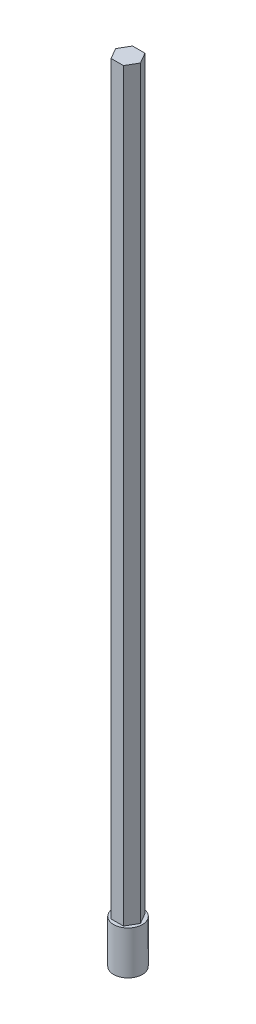
ISO-10303-21;
HEADER;
FILE_DESCRIPTION(('STEP AP214'),'2;1');
FILE_NAME('part.step','',(''),(''),'','','');
FILE_SCHEMA(('AUTOMOTIVE_DESIGN { 1 0 10303 214 1 1 1 1 }'));
ENDSEC;
DATA;
#1=APPLICATION_CONTEXT('core data for automotive mechanical design processes');
#2=APPLICATION_PROTOCOL_DEFINITION('international standard','automotive_design',2000,#1);
#3=PRODUCT_CONTEXT('',#1,'mechanical');
#4=PRODUCT('Part','Part','',(#3));
#5=PRODUCT_RELATED_PRODUCT_CATEGORY('part','',(#4));
#6=PRODUCT_DEFINITION_FORMATION('','',#4);
#7=PRODUCT_DEFINITION_CONTEXT('part definition',#1,'design');
#8=PRODUCT_DEFINITION('design','',#6,#7);
#9=PRODUCT_DEFINITION_SHAPE('','',#8);
#10=(LENGTH_UNIT() NAMED_UNIT(*) SI_UNIT(.MILLI.,.METRE.));
#11=(NAMED_UNIT(*) PLANE_ANGLE_UNIT() SI_UNIT($,.RADIAN.));
#12=(NAMED_UNIT(*) SI_UNIT($,.STERADIAN.) SOLID_ANGLE_UNIT());
#13=UNCERTAINTY_MEASURE_WITH_UNIT(LENGTH_MEASURE(1.E-05),#10,'distance_accuracy_value','');
#14=(GEOMETRIC_REPRESENTATION_CONTEXT(3) GLOBAL_UNCERTAINTY_ASSIGNED_CONTEXT((#13)) GLOBAL_UNIT_ASSIGNED_CONTEXT((#10,
#11,#12)) REPRESENTATION_CONTEXT('',''));
#15=CARTESIAN_POINT('',(0.,0.,0.));
#16=DIRECTION('',(0.,0.,1.));
#17=DIRECTION('',(1.,0.,0.));
#18=AXIS2_PLACEMENT_3D('',#15,#16,#17);
#19=CARTESIAN_POINT('',(86.6025403784457,11000.,149.999999999999));
#20=DIRECTION('',(-0.866025403784442,0.,-0.499999999999995));
#21=DIRECTION('',(-0.499999999999995,0.,0.866025403784442));
#22=AXIS2_PLACEMENT_3D('',#19,#20,#21);
#23=PLANE('',#22);
#24=DIRECTION('',(-0.499999999999995,0.,0.866025403784442));
#25=VECTOR('',#24,1.);
#26=CARTESIAN_POINT('',(86.6025403784457,604.000000000001,149.999999999999));
#27=LINE('',#26,#25);
#28=CARTESIAN_POINT('',(173.205080756888,604.000000000001,0.));
#29=VERTEX_POINT('',#28);
#30=CARTESIAN_POINT('',(86.6025403784457,604.000000000001,149.999999999999));
#31=VERTEX_POINT('',#30);
#32=EDGE_CURVE('E47',#29,#31,#27,.T.);
#33=ORIENTED_EDGE('',*,*,#32,.F.);
#34=DIRECTION('',(0.,-1.,0.));
#35=VECTOR('',#34,1.);
#36=CARTESIAN_POINT('',(173.205080756888,11000.,0.));
#37=LINE('',#36,#35);
#38=CARTESIAN_POINT('',(173.205080756888,11000.,0.));
#39=VERTEX_POINT('',#38);
#40=EDGE_CURVE('E40',#39,#29,#37,.T.);
#41=ORIENTED_EDGE('',*,*,#40,.F.);
#42=DIRECTION('',(0.499999999999995,0.,-0.866025403784442));
#43=VECTOR('',#42,1.);
#44=CARTESIAN_POINT('',(86.6025403784457,11000.,149.999999999999));
#45=LINE('',#44,#43);
#46=CARTESIAN_POINT('',(86.6025403784457,11000.,149.999999999999));
#47=VERTEX_POINT('',#46);
#48=EDGE_CURVE('E110',#47,#39,#45,.T.);
#49=ORIENTED_EDGE('',*,*,#48,.F.);
#50=DIRECTION('',(0.,-1.,0.));
#51=VECTOR('',#50,1.);
#52=CARTESIAN_POINT('',(86.6025403784457,11000.,149.999999999999));
#53=LINE('',#52,#51);
#54=EDGE_CURVE('E96',#47,#31,#53,.T.);
#55=ORIENTED_EDGE('',*,*,#54,.T.);
#56=EDGE_LOOP('',(#33,#41,#49,#55));
#57=FACE_BOUND('',#56,.T.);
#58=ADVANCED_FACE('F33',(#57),#23,.F.);
#59=CARTESIAN_POINT('',(173.205080756888,11000.,0.));
#60=DIRECTION('',(-0.866025403784438,0.,0.500000000000001));
#61=DIRECTION('',(0.500000000000001,0.,0.866025403784438));
#62=AXIS2_PLACEMENT_3D('',#59,#60,#61);
#63=PLANE('',#62);
#64=DIRECTION('',(0.500000000000001,0.,0.866025403784438));
#65=VECTOR('',#64,1.);
#66=CARTESIAN_POINT('',(173.205080756888,604.000000000001,0.));
#67=LINE('',#66,#65);
#68=CARTESIAN_POINT('',(86.6025403784436,604.000000000001,-150.));
#69=VERTEX_POINT('',#68);
#70=EDGE_CURVE('E54',#69,#29,#67,.T.);
#71=ORIENTED_EDGE('',*,*,#70,.F.);
#72=DIRECTION('',(0.,-1.,0.));
#73=VECTOR('',#72,1.);
#74=CARTESIAN_POINT('',(86.6025403784436,11000.,-150.));
#75=LINE('',#74,#73);
#76=CARTESIAN_POINT('',(86.6025403784436,11000.,-150.));
#77=VERTEX_POINT('',#76);
#78=EDGE_CURVE('E132',#77,#69,#75,.T.);
#79=ORIENTED_EDGE('',*,*,#78,.F.);
#80=DIRECTION('',(-0.500000000000001,0.,-0.866025403784438));
#81=VECTOR('',#80,1.);
#82=CARTESIAN_POINT('',(173.205080756888,11000.,0.));
#83=LINE('',#82,#81);
#84=EDGE_CURVE('E113',#39,#77,#83,.T.);
#85=ORIENTED_EDGE('',*,*,#84,.F.);
#86=ORIENTED_EDGE('',*,*,#40,.T.);
#87=EDGE_LOOP('',(#71,#79,#85,#86));
#88=FACE_BOUND('',#87,.T.);
#89=ADVANCED_FACE('F133',(#88),#63,.F.);
#90=CARTESIAN_POINT('',(86.6025403784436,11000.,-150.));
#91=DIRECTION('',(0.,0.,1.));
#92=DIRECTION('',(1.,0.,0.));
#93=AXIS2_PLACEMENT_3D('',#90,#91,#92);
#94=PLANE('',#93);
#95=DIRECTION('',(1.,0.,0.));
#96=VECTOR('',#95,1.);
#97=CARTESIAN_POINT('',(86.6025403784436,604.000000000001,-150.));
#98=LINE('',#97,#96);
#99=CARTESIAN_POINT('',(-86.6025403784446,604.000000000001,-150.));
#100=VERTEX_POINT('',#99);
#101=EDGE_CURVE('E115',#100,#69,#98,.T.);
#102=ORIENTED_EDGE('',*,*,#101,.F.);
#103=DIRECTION('',(0.,-1.,0.));
#104=VECTOR('',#103,1.);
#105=CARTESIAN_POINT('',(-86.6025403784446,11000.,-150.));
#106=LINE('',#105,#104);
#107=CARTESIAN_POINT('',(-86.6025403784446,11000.,-150.));
#108=VERTEX_POINT('',#107);
#109=EDGE_CURVE('E129',#108,#100,#106,.T.);
#110=ORIENTED_EDGE('',*,*,#109,.F.);
#111=DIRECTION('',(-1.,0.,0.));
#112=VECTOR('',#111,1.);
#113=CARTESIAN_POINT('',(86.6025403784436,11000.,-150.));
#114=LINE('',#113,#112);
#115=EDGE_CURVE('E120',#77,#108,#114,.T.);
#116=ORIENTED_EDGE('',*,*,#115,.F.);
#117=ORIENTED_EDGE('',*,*,#78,.T.);
#118=EDGE_LOOP('',(#102,#110,#116,#117));
#119=FACE_BOUND('',#118,.T.);
#120=ADVANCED_FACE('F166',(#119),#94,.F.);
#121=CARTESIAN_POINT('',(-86.6025403784446,11000.,-150.));
#122=DIRECTION('',(0.866025403784442,0.,0.499999999999995));
#123=DIRECTION('',(0.499999999999995,0.,-0.866025403784442));
#124=AXIS2_PLACEMENT_3D('',#121,#122,#123);
#125=PLANE('',#124);
#126=DIRECTION('',(0.499999999999995,0.,-0.866025403784442));
#127=VECTOR('',#126,1.);
#128=CARTESIAN_POINT('',(-86.6025403784446,604.000000000001,-150.));
#129=LINE('',#128,#127);
#130=CARTESIAN_POINT('',(-173.205080756888,604.000000000001,1.20948461451098E-12));
#131=VERTEX_POINT('',#130);
#132=EDGE_CURVE('E105',#131,#100,#129,.T.);
#133=ORIENTED_EDGE('',*,*,#132,.F.);
#134=DIRECTION('',(0.,-1.,0.));
#135=VECTOR('',#134,1.);
#136=CARTESIAN_POINT('',(-173.205080756888,11000.,1.20948461451098E-12));
#137=LINE('',#136,#135);
#138=CARTESIAN_POINT('',(-173.205080756888,11000.,1.20948461451098E-12));
#139=VERTEX_POINT('',#138);
#140=EDGE_CURVE('E95',#139,#131,#137,.T.);
#141=ORIENTED_EDGE('',*,*,#140,.F.);
#142=DIRECTION('',(-0.499999999999995,0.,0.866025403784442));
#143=VECTOR('',#142,1.);
#144=CARTESIAN_POINT('',(-86.6025403784446,11000.,-150.));
#145=LINE('',#144,#143);
#146=EDGE_CURVE('E122',#108,#139,#145,.T.);
#147=ORIENTED_EDGE('',*,*,#146,.F.);
#148=ORIENTED_EDGE('',*,*,#109,.T.);
#149=EDGE_LOOP('',(#133,#141,#147,#148));
#150=FACE_BOUND('',#149,.T.);
#151=ADVANCED_FACE('F141',(#150),#125,.F.);
#152=CARTESIAN_POINT('',(-173.205080756888,11000.,1.20948461451098E-12));
#153=DIRECTION('',(0.866025403784435,0.,-0.500000000000007));
#154=DIRECTION('',(-0.500000000000007,0.,-0.866025403784435));
#155=AXIS2_PLACEMENT_3D('',#152,#153,#154);
#156=PLANE('',#155);
#157=DIRECTION('',(-0.500000000000007,0.,-0.866025403784435));
#158=VECTOR('',#157,1.);
#159=CARTESIAN_POINT('',(-173.205080756888,604.000000000001,1.20948461451098E-12));
#160=LINE('',#159,#158);
#161=CARTESIAN_POINT('',(-86.6025403784425,604.000000000001,150.000000000001));
#162=VERTEX_POINT('',#161);
#163=EDGE_CURVE('E100',#162,#131,#160,.T.);
#164=ORIENTED_EDGE('',*,*,#163,.F.);
#165=DIRECTION('',(0.,-1.,0.));
#166=VECTOR('',#165,1.);
#167=CARTESIAN_POINT('',(-86.6025403784425,11000.,150.000000000001));
#168=LINE('',#167,#166);
#169=CARTESIAN_POINT('',(-86.6025403784425,11000.,150.000000000001));
#170=VERTEX_POINT('',#169);
#171=EDGE_CURVE('E88',#170,#162,#168,.T.);
#172=ORIENTED_EDGE('',*,*,#171,.F.);
#173=DIRECTION('',(0.500000000000007,0.,0.866025403784435));
#174=VECTOR('',#173,1.);
#175=CARTESIAN_POINT('',(-173.205080756888,11000.,1.20948461451098E-12));
#176=LINE('',#175,#174);
#177=EDGE_CURVE('E124',#139,#170,#176,.T.);
#178=ORIENTED_EDGE('',*,*,#177,.F.);
#179=ORIENTED_EDGE('',*,*,#140,.T.);
#180=EDGE_LOOP('',(#164,#172,#178,#179));
#181=FACE_BOUND('',#180,.T.);
#182=ADVANCED_FACE('F101',(#181),#156,.F.);
#183=CARTESIAN_POINT('',(-86.6025403784425,11000.,150.000000000001));
#184=DIRECTION('',(0.,0.,-1.));
#185=DIRECTION('',(-1.,0.,0.));
#186=AXIS2_PLACEMENT_3D('',#183,#184,#185);
#187=PLANE('',#186);
#188=DIRECTION('',(-1.,0.,0.));
#189=VECTOR('',#188,1.);
#190=CARTESIAN_POINT('',(-86.6025403784425,604.000000000001,150.000000000001));
#191=LINE('',#190,#189);
#192=EDGE_CURVE('E11',#31,#162,#191,.T.);
#193=ORIENTED_EDGE('',*,*,#192,.F.);
#194=ORIENTED_EDGE('',*,*,#54,.F.);
#195=DIRECTION('',(1.,0.,0.));
#196=VECTOR('',#195,1.);
#197=CARTESIAN_POINT('',(-86.6025403784425,11000.,150.000000000001));
#198=LINE('',#197,#196);
#199=EDGE_CURVE('E92',#170,#47,#198,.T.);
#200=ORIENTED_EDGE('',*,*,#199,.F.);
#201=ORIENTED_EDGE('',*,*,#171,.T.);
#202=EDGE_LOOP('',(#193,#194,#200,#201));
#203=FACE_BOUND('',#202,.T.);
#204=ADVANCED_FACE('F90',(#203),#187,.F.);
#205=CARTESIAN_POINT('',(0.,11000.,0.));
#206=DIRECTION('',(0.,1.,0.));
#207=DIRECTION('',(0.,0.,1.));
#208=AXIS2_PLACEMENT_3D('',#205,#206,#207);
#209=PLANE('',#208);
#210=ORIENTED_EDGE('',*,*,#48,.T.);
#211=ORIENTED_EDGE('',*,*,#84,.T.);
#212=ORIENTED_EDGE('',*,*,#115,.T.);
#213=ORIENTED_EDGE('',*,*,#146,.T.);
#214=ORIENTED_EDGE('',*,*,#177,.T.);
#215=ORIENTED_EDGE('',*,*,#199,.T.);
#216=EDGE_LOOP('',(#210,#211,#212,#213,#214,#215));
#217=FACE_BOUND('',#216,.T.);
#218=ADVANCED_FACE('F136',(#217),#209,.T.);
#219=CARTESIAN_POINT('',(0.,604.,0.));
#220=DIRECTION('',(0.,-1.,0.));
#221=DIRECTION('',(0.,0.,-1.));
#222=AXIS2_PLACEMENT_3D('',#219,#220,#221);
#223=PLANE('',#222);
#224=CARTESIAN_POINT('',(0.,604.,0.));
#225=DIRECTION('',(0.,-1.,0.));
#226=DIRECTION('',(0.,0.,-1.));
#227=AXIS2_PLACEMENT_3D('',#224,#225,#226);
#228=CIRCLE('',#227,200.);
#229=CARTESIAN_POINT('',(0.,604.,-200.));
#230=VERTEX_POINT('',#229);
#231=EDGE_CURVE('E106',#230,#230,#228,.T.);
#232=ORIENTED_EDGE('',*,*,#231,.F.);
#233=EDGE_LOOP('',(#232));
#234=FACE_BOUND('',#233,.T.);
#235=ORIENTED_EDGE('',*,*,#70,.T.);
#236=ORIENTED_EDGE('',*,*,#32,.T.);
#237=ORIENTED_EDGE('',*,*,#192,.T.);
#238=ORIENTED_EDGE('',*,*,#163,.T.);
#239=ORIENTED_EDGE('',*,*,#132,.T.);
#240=ORIENTED_EDGE('',*,*,#101,.T.);
#241=EDGE_LOOP('',(#235,#236,#237,#238,#239,#240));
#242=FACE_BOUND('',#241,.T.);
#243=ADVANCED_FACE('F108',(#234,#242),#223,.F.);
#244=CARTESIAN_POINT('',(0.,604.,0.));
#245=DIRECTION('',(0.,-1.,0.));
#246=DIRECTION('',(0.,0.,-1.));
#247=AXIS2_PLACEMENT_3D('',#244,#245,#246);
#248=CYLINDRICAL_SURFACE('',#247,200.);
#249=ORIENTED_EDGE('',*,*,#231,.T.);
#250=EDGE_LOOP('',(#249));
#251=FACE_BOUND('',#250,.T.);
#252=CARTESIAN_POINT('',(0.,0.,0.));
#253=DIRECTION('',(0.,-1.,0.));
#254=DIRECTION('',(0.,0.,-1.));
#255=AXIS2_PLACEMENT_3D('',#252,#253,#254);
#256=CIRCLE('',#255,200.);
#257=CARTESIAN_POINT('',(0.,0.,-200.));
#258=VERTEX_POINT('',#257);
#259=EDGE_CURVE('E144',#258,#258,#256,.T.);
#260=ORIENTED_EDGE('',*,*,#259,.F.);
#261=EDGE_LOOP('',(#260));
#262=FACE_BOUND('',#261,.T.);
#263=ADVANCED_FACE('F150',(#251,#262),#248,.T.);
#264=CARTESIAN_POINT('',(0.,0.,0.));
#265=DIRECTION('',(0.,1.,0.));
#266=DIRECTION('',(0.,0.,1.));
#267=AXIS2_PLACEMENT_3D('',#264,#265,#266);
#268=PLANE('',#267);
#269=ORIENTED_EDGE('',*,*,#259,.T.);
#270=EDGE_LOOP('',(#269));
#271=FACE_BOUND('',#270,.T.);
#272=ADVANCED_FACE('F159',(#271),#268,.F.);
#273=CLOSED_SHELL('',(#58,#89,#120,#151,#182,#204,#218,#243,#263,#272));
#274=MANIFOLD_SOLID_BREP('B2',#273);
#275=ADVANCED_BREP_SHAPE_REPRESENTATION('',(#18,#274),#14);
#276=SHAPE_DEFINITION_REPRESENTATION(#9,#275);
ENDSEC;
END-ISO-10303-21;
